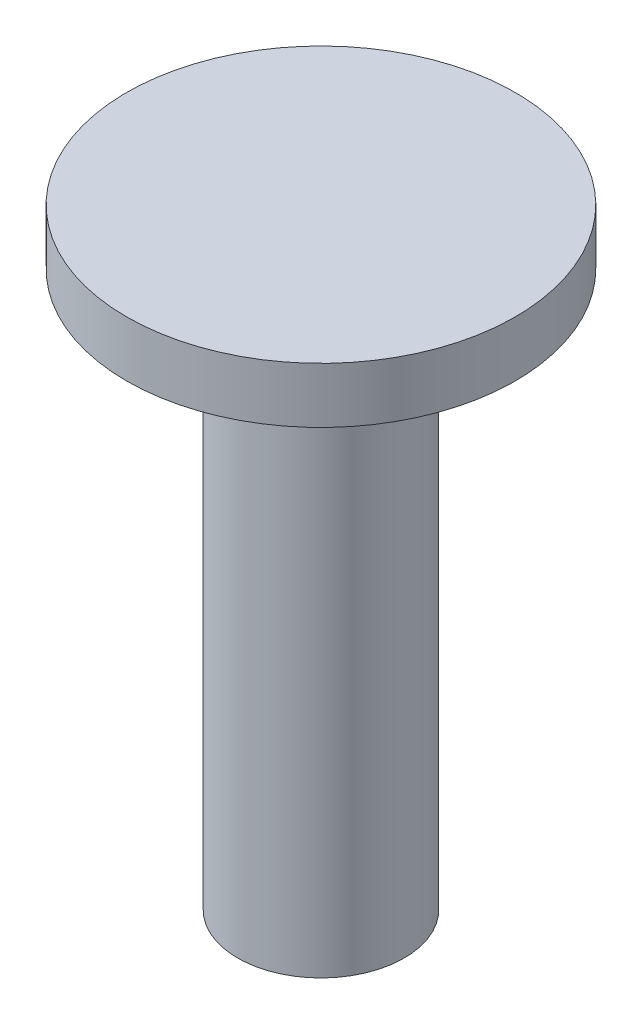
ISO-10303-21;
HEADER;
FILE_DESCRIPTION(('STEP AP214'),'2;1');
FILE_NAME('part.step','',(''),(''),'','','');
FILE_SCHEMA(('AUTOMOTIVE_DESIGN { 1 0 10303 214 1 1 1 1 }'));
ENDSEC;
DATA;
#1=APPLICATION_CONTEXT('core data for automotive mechanical design processes');
#2=APPLICATION_PROTOCOL_DEFINITION('international standard','automotive_design',2000,#1);
#3=PRODUCT_CONTEXT('',#1,'mechanical');
#4=PRODUCT('Part','Part','',(#3));
#5=PRODUCT_RELATED_PRODUCT_CATEGORY('part','',(#4));
#6=PRODUCT_DEFINITION_FORMATION('','',#4);
#7=PRODUCT_DEFINITION_CONTEXT('part definition',#1,'design');
#8=PRODUCT_DEFINITION('design','',#6,#7);
#9=PRODUCT_DEFINITION_SHAPE('','',#8);
#10=(LENGTH_UNIT() NAMED_UNIT(*) SI_UNIT(.MILLI.,.METRE.));
#11=(NAMED_UNIT(*) PLANE_ANGLE_UNIT() SI_UNIT($,.RADIAN.));
#12=(NAMED_UNIT(*) SI_UNIT($,.STERADIAN.) SOLID_ANGLE_UNIT());
#13=UNCERTAINTY_MEASURE_WITH_UNIT(LENGTH_MEASURE(1.E-05),#10,'distance_accuracy_value','');
#14=(GEOMETRIC_REPRESENTATION_CONTEXT(3) GLOBAL_UNCERTAINTY_ASSIGNED_CONTEXT((#13)) GLOBAL_UNIT_ASSIGNED_CONTEXT((#10,
#11,#12)) REPRESENTATION_CONTEXT('',''));
#15=CARTESIAN_POINT('',(0.,0.,0.));
#16=DIRECTION('',(0.,0.,1.));
#17=DIRECTION('',(1.,0.,0.));
#18=AXIS2_PLACEMENT_3D('',#15,#16,#17);
#19=CARTESIAN_POINT('',(0.,1.,0.));
#20=DIRECTION('',(0.,-1.,0.));
#21=DIRECTION('',(0.,0.,-1.));
#22=AXIS2_PLACEMENT_3D('',#19,#20,#21);
#23=CYLINDRICAL_SURFACE('',#22,3.5);
#24=CARTESIAN_POINT('',(0.,1.,0.));
#25=DIRECTION('',(0.,1.,0.));
#26=DIRECTION('',(0.,0.,1.));
#27=AXIS2_PLACEMENT_3D('',#24,#25,#26);
#28=CIRCLE('',#27,3.5);
#29=CARTESIAN_POINT('',(0.,1.,3.5));
#30=VERTEX_POINT('',#29);
#31=EDGE_CURVE('E49',#30,#30,#28,.T.);
#32=ORIENTED_EDGE('',*,*,#31,.F.);
#33=EDGE_LOOP('',(#32));
#34=FACE_BOUND('',#33,.T.);
#35=CARTESIAN_POINT('',(0.,0.,0.));
#36=DIRECTION('',(0.,1.,0.));
#37=DIRECTION('',(0.,0.,1.));
#38=AXIS2_PLACEMENT_3D('',#35,#36,#37);
#39=CIRCLE('',#38,3.5);
#40=CARTESIAN_POINT('',(0.,0.,3.5));
#41=VERTEX_POINT('',#40);
#42=EDGE_CURVE('E44',#41,#41,#39,.T.);
#43=ORIENTED_EDGE('',*,*,#42,.T.);
#44=EDGE_LOOP('',(#43));
#45=FACE_BOUND('',#44,.T.);
#46=ADVANCED_FACE('F41',(#34,#45),#23,.T.);
#47=CARTESIAN_POINT('',(0.,1.,0.));
#48=DIRECTION('',(0.,1.,0.));
#49=DIRECTION('',(0.,0.,1.));
#50=AXIS2_PLACEMENT_3D('',#47,#48,#49);
#51=PLANE('',#50);
#52=ORIENTED_EDGE('',*,*,#31,.T.);
#53=EDGE_LOOP('',(#52));
#54=FACE_BOUND('',#53,.T.);
#55=ADVANCED_FACE('F69',(#54),#51,.T.);
#56=CARTESIAN_POINT('',(0.,0.,0.));
#57=DIRECTION('',(0.,1.,0.));
#58=DIRECTION('',(0.,0.,1.));
#59=AXIS2_PLACEMENT_3D('',#56,#57,#58);
#60=PLANE('',#59);
#61=CARTESIAN_POINT('',(0.,0.,0.));
#62=DIRECTION('',(0.,-1.,0.));
#63=DIRECTION('',(0.,0.,-1.));
#64=AXIS2_PLACEMENT_3D('',#61,#62,#63);
#65=CIRCLE('',#64,1.5);
#66=CARTESIAN_POINT('',(0.,0.,-1.5));
#67=VERTEX_POINT('',#66);
#68=EDGE_CURVE('E10',#67,#67,#65,.T.);
#69=ORIENTED_EDGE('',*,*,#68,.F.);
#70=EDGE_LOOP('',(#69));
#71=FACE_BOUND('',#70,.T.);
#72=ORIENTED_EDGE('',*,*,#42,.F.);
#73=EDGE_LOOP('',(#72));
#74=FACE_BOUND('',#73,.T.);
#75=ADVANCED_FACE('F66',(#71,#74),#60,.F.);
#76=CARTESIAN_POINT('',(0.,-10.,0.));
#77=DIRECTION('',(0.,1.,0.));
#78=DIRECTION('',(0.,0.,1.));
#79=AXIS2_PLACEMENT_3D('',#76,#77,#78);
#80=CYLINDRICAL_SURFACE('',#79,1.5);
#81=CARTESIAN_POINT('',(0.,-10.,0.));
#82=DIRECTION('',(0.,-1.,0.));
#83=DIRECTION('',(0.,0.,-1.));
#84=AXIS2_PLACEMENT_3D('',#81,#82,#83);
#85=CIRCLE('',#84,1.5);
#86=CARTESIAN_POINT('',(0.,-10.,-1.5));
#87=VERTEX_POINT('',#86);
#88=EDGE_CURVE('E56',#87,#87,#85,.T.);
#89=ORIENTED_EDGE('',*,*,#88,.F.);
#90=EDGE_LOOP('',(#89));
#91=FACE_BOUND('',#90,.T.);
#92=ORIENTED_EDGE('',*,*,#68,.T.);
#93=EDGE_LOOP('',(#92));
#94=FACE_BOUND('',#93,.T.);
#95=ADVANCED_FACE('F68',(#91,#94),#80,.T.);
#96=CARTESIAN_POINT('',(0.,-10.,0.));
#97=DIRECTION('',(0.,-1.,0.));
#98=DIRECTION('',(0.,0.,-1.));
#99=AXIS2_PLACEMENT_3D('',#96,#97,#98);
#100=PLANE('',#99);
#101=ORIENTED_EDGE('',*,*,#88,.T.);
#102=EDGE_LOOP('',(#101));
#103=FACE_BOUND('',#102,.T.);
#104=ADVANCED_FACE('F75',(#103),#100,.T.);
#105=CLOSED_SHELL('',(#46,#55,#75,#95,#104));
#106=MANIFOLD_SOLID_BREP('B2',#105);
#107=ADVANCED_BREP_SHAPE_REPRESENTATION('',(#18,#106),#14);
#108=SHAPE_DEFINITION_REPRESENTATION(#9,#107);
ENDSEC;
END-ISO-10303-21;
